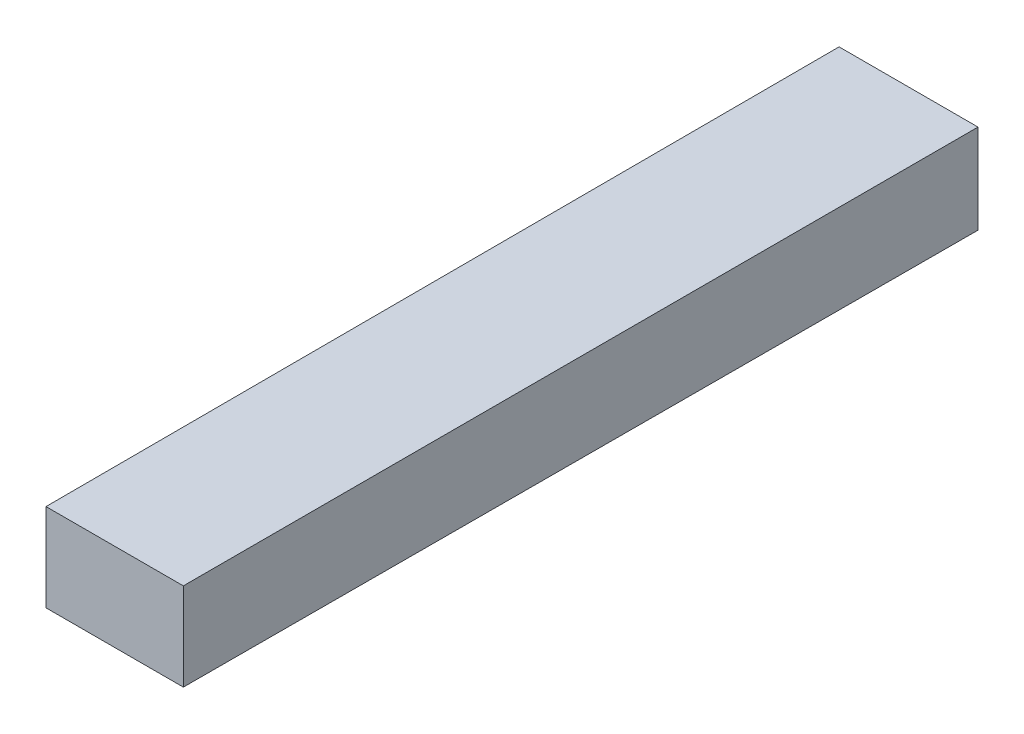
ISO-10303-21;
HEADER;
FILE_DESCRIPTION(('STEP AP214'),'2;1');
FILE_NAME('part.step','',(''),(''),'','','');
FILE_SCHEMA(('AUTOMOTIVE_DESIGN { 1 0 10303 214 1 1 1 1 }'));
ENDSEC;
DATA;
#1=APPLICATION_CONTEXT('core data for automotive mechanical design processes');
#2=APPLICATION_PROTOCOL_DEFINITION('international standard','automotive_design',2000,#1);
#3=PRODUCT_CONTEXT('',#1,'mechanical');
#4=PRODUCT('Part','Part','',(#3));
#5=PRODUCT_RELATED_PRODUCT_CATEGORY('part','',(#4));
#6=PRODUCT_DEFINITION_FORMATION('','',#4);
#7=PRODUCT_DEFINITION_CONTEXT('part definition',#1,'design');
#8=PRODUCT_DEFINITION('design','',#6,#7);
#9=PRODUCT_DEFINITION_SHAPE('','',#8);
#10=(LENGTH_UNIT() NAMED_UNIT(*) SI_UNIT(.MILLI.,.METRE.));
#11=(NAMED_UNIT(*) PLANE_ANGLE_UNIT() SI_UNIT($,.RADIAN.));
#12=(NAMED_UNIT(*) SI_UNIT($,.STERADIAN.) SOLID_ANGLE_UNIT());
#13=UNCERTAINTY_MEASURE_WITH_UNIT(LENGTH_MEASURE(1.E-05),#10,'distance_accuracy_value','');
#14=(GEOMETRIC_REPRESENTATION_CONTEXT(3) GLOBAL_UNCERTAINTY_ASSIGNED_CONTEXT((#13)) GLOBAL_UNIT_ASSIGNED_CONTEXT((#10,
#11,#12)) REPRESENTATION_CONTEXT('',''));
#15=CARTESIAN_POINT('',(0.,0.,0.));
#16=DIRECTION('',(0.,0.,1.));
#17=DIRECTION('',(1.,0.,0.));
#18=AXIS2_PLACEMENT_3D('',#15,#16,#17);
#19=CARTESIAN_POINT('',(0.,0.,0.));
#20=DIRECTION('',(0.999999499926378,0.,0.00100007349468926));
#21=DIRECTION('',(0.00100007349468926,0.,-0.999999499926378));
#22=AXIS2_PLACEMENT_3D('',#19,#20,#21);
#23=PLANE('',#22);
#24=DIRECTION('',(0.,1.,0.));
#25=VECTOR('',#24,1.);
#26=CARTESIAN_POINT('',(0.,0.,0.));
#27=LINE('',#26,#25);
#28=CARTESIAN_POINT('',(0.,0.,0.));
#29=VERTEX_POINT('',#28);
#30=CARTESIAN_POINT('',(0.,9.,0.));
#31=VERTEX_POINT('',#30);
#32=EDGE_CURVE('E92',#29,#31,#27,.T.);
#33=ORIENTED_EDGE('',*,*,#32,.T.);
#34=DIRECTION('',(0.00100007299457939,0.00100007299457939,-0.999998999853505));
#35=VECTOR('',#34,1.);
#36=CARTESIAN_POINT('',(0.,9.,0.));
#37=LINE('',#36,#35);
#38=CARTESIAN_POINT('',(-0.0800059195839909,8.91999408041601,80.));
#39=VERTEX_POINT('',#38);
#40=EDGE_CURVE('E11',#39,#31,#37,.T.);
#41=ORIENTED_EDGE('',*,*,#40,.F.);
#42=DIRECTION('',(0.,-1.,0.));
#43=VECTOR('',#42,1.);
#44=CARTESIAN_POINT('',(-0.0800059195839909,0.,80.));
#45=LINE('',#44,#43);
#46=CARTESIAN_POINT('',(-0.0800059195839909,0.0800059195839909,80.));
#47=VERTEX_POINT('',#46);
#48=EDGE_CURVE('E112',#47,#39,#45,.F.);
#49=ORIENTED_EDGE('',*,*,#48,.F.);
#50=DIRECTION('',(0.00100007299457939,-0.00100007299457939,-0.999998999853505));
#51=VECTOR('',#50,1.);
#52=CARTESIAN_POINT('',(0.,0.,0.));
#53=LINE('',#52,#51);
#54=EDGE_CURVE('E104',#47,#29,#53,.T.);
#55=ORIENTED_EDGE('',*,*,#54,.T.);
#56=EDGE_LOOP('',(#33,#41,#49,#55));
#57=FACE_BOUND('',#56,.T.);
#58=ADVANCED_FACE('F45',(#57),#23,.T.);
#59=CARTESIAN_POINT('',(0.,9.,0.));
#60=DIRECTION('',(0.,0.999999499926378,0.00100007349468926));
#61=DIRECTION('',(0.,-0.00100007349468926,0.999999499926378));
#62=AXIS2_PLACEMENT_3D('',#59,#60,#61);
#63=PLANE('',#62);
#64=DIRECTION('',(-1.,0.,0.));
#65=VECTOR('',#64,1.);
#66=CARTESIAN_POINT('',(0.,9.,0.));
#67=LINE('',#66,#65);
#68=CARTESIAN_POINT('',(-14.,9.,0.));
#69=VERTEX_POINT('',#68);
#70=EDGE_CURVE('E88',#31,#69,#67,.T.);
#71=ORIENTED_EDGE('',*,*,#70,.T.);
#72=DIRECTION('',(-0.00100007299457939,0.00100007299457939,-0.999998999853505));
#73=VECTOR('',#72,1.);
#74=CARTESIAN_POINT('',(-13.999990998686,8.99999099868605,0.00900064794923897));
#75=LINE('',#74,#73);
#76=CARTESIAN_POINT('',(-13.919994080416,8.91999408041601,80.));
#77=VERTEX_POINT('',#76);
#78=EDGE_CURVE('E55',#77,#69,#75,.T.);
#79=ORIENTED_EDGE('',*,*,#78,.F.);
#80=DIRECTION('',(1.,0.,0.));
#81=VECTOR('',#80,1.);
#82=CARTESIAN_POINT('',(0.,8.91999408041601,80.));
#83=LINE('',#82,#81);
#84=EDGE_CURVE('E100',#39,#77,#83,.F.);
#85=ORIENTED_EDGE('',*,*,#84,.F.);
#86=ORIENTED_EDGE('',*,*,#40,.T.);
#87=EDGE_LOOP('',(#71,#79,#85,#86));
#88=FACE_BOUND('',#87,.T.);
#89=ADVANCED_FACE('F47',(#88),#63,.T.);
#90=CARTESIAN_POINT('',(-14.,0.,0.));
#91=DIRECTION('',(-0.999999499926378,0.,0.00100007349468926));
#92=DIRECTION('',(0.00100007349468926,0.,0.999999499926378));
#93=AXIS2_PLACEMENT_3D('',#90,#91,#92);
#94=PLANE('',#93);
#95=DIRECTION('',(0.,-1.,0.));
#96=VECTOR('',#95,1.);
#97=CARTESIAN_POINT('',(-14.,0.,0.));
#98=LINE('',#97,#96);
#99=CARTESIAN_POINT('',(-14.,0.,0.));
#100=VERTEX_POINT('',#99);
#101=EDGE_CURVE('E93',#69,#100,#98,.T.);
#102=ORIENTED_EDGE('',*,*,#101,.T.);
#103=DIRECTION('',(-0.00100007299457939,-0.00100007299457939,-0.999998999853505));
#104=VECTOR('',#103,1.);
#105=CARTESIAN_POINT('',(-13.9999859979561,1.40020439228177E-05,0.0140010079210384));
#106=LINE('',#105,#104);
#107=CARTESIAN_POINT('',(-13.919994080416,0.0800059195839909,80.));
#108=VERTEX_POINT('',#107);
#109=EDGE_CURVE('E116',#108,#100,#106,.T.);
#110=ORIENTED_EDGE('',*,*,#109,.F.);
#111=DIRECTION('',(0.,1.,0.));
#112=VECTOR('',#111,1.);
#113=CARTESIAN_POINT('',(-13.919994080416,0.,80.));
#114=LINE('',#113,#112);
#115=EDGE_CURVE('E67',#77,#108,#114,.F.);
#116=ORIENTED_EDGE('',*,*,#115,.F.);
#117=ORIENTED_EDGE('',*,*,#78,.T.);
#118=EDGE_LOOP('',(#102,#110,#116,#117));
#119=FACE_BOUND('',#118,.T.);
#120=ADVANCED_FACE('F129',(#119),#94,.T.);
#121=CARTESIAN_POINT('',(0.,0.,0.));
#122=DIRECTION('',(0.,-0.999999499926378,0.00100007349468926));
#123=DIRECTION('',(0.,-0.00100007349468926,-0.999999499926378));
#124=AXIS2_PLACEMENT_3D('',#121,#122,#123);
#125=PLANE('',#124);
#126=DIRECTION('',(1.,0.,0.));
#127=VECTOR('',#126,1.);
#128=CARTESIAN_POINT('',(0.,0.,0.));
#129=LINE('',#128,#127);
#130=EDGE_CURVE('E110',#100,#29,#129,.T.);
#131=ORIENTED_EDGE('',*,*,#130,.T.);
#132=ORIENTED_EDGE('',*,*,#54,.F.);
#133=DIRECTION('',(-1.,0.,0.));
#134=VECTOR('',#133,1.);
#135=CARTESIAN_POINT('',(0.,0.0800059195839909,80.));
#136=LINE('',#135,#134);
#137=EDGE_CURVE('E49',#108,#47,#136,.F.);
#138=ORIENTED_EDGE('',*,*,#137,.F.);
#139=ORIENTED_EDGE('',*,*,#109,.T.);
#140=EDGE_LOOP('',(#131,#132,#138,#139));
#141=FACE_BOUND('',#140,.T.);
#142=ADVANCED_FACE('F131',(#141),#125,.T.);
#143=CARTESIAN_POINT('',(0.,0.,80.));
#144=DIRECTION('',(0.,0.,1.));
#145=DIRECTION('',(1.,0.,0.));
#146=AXIS2_PLACEMENT_3D('',#143,#144,#145);
#147=PLANE('',#146);
#148=ORIENTED_EDGE('',*,*,#48,.T.);
#149=ORIENTED_EDGE('',*,*,#84,.T.);
#150=ORIENTED_EDGE('',*,*,#115,.T.);
#151=ORIENTED_EDGE('',*,*,#137,.T.);
#152=EDGE_LOOP('',(#148,#149,#150,#151));
#153=FACE_BOUND('',#152,.T.);
#154=ADVANCED_FACE('F127',(#153),#147,.T.);
#155=CARTESIAN_POINT('',(0.,0.,0.));
#156=DIRECTION('',(0.,0.,1.));
#157=DIRECTION('',(1.,0.,0.));
#158=AXIS2_PLACEMENT_3D('',#155,#156,#157);
#159=PLANE('',#158);
#160=ORIENTED_EDGE('',*,*,#32,.F.);
#161=ORIENTED_EDGE('',*,*,#130,.F.);
#162=ORIENTED_EDGE('',*,*,#101,.F.);
#163=ORIENTED_EDGE('',*,*,#70,.F.);
#164=EDGE_LOOP('',(#160,#161,#162,#163));
#165=FACE_BOUND('',#164,.T.);
#166=ADVANCED_FACE('F89',(#165),#159,.F.);
#167=CLOSED_SHELL('',(#58,#89,#120,#142,#154,#166));
#168=MANIFOLD_SOLID_BREP('B2',#167);
#169=ADVANCED_BREP_SHAPE_REPRESENTATION('',(#18,#168),#14);
#170=SHAPE_DEFINITION_REPRESENTATION(#9,#169);
ENDSEC;
END-ISO-10303-21;
